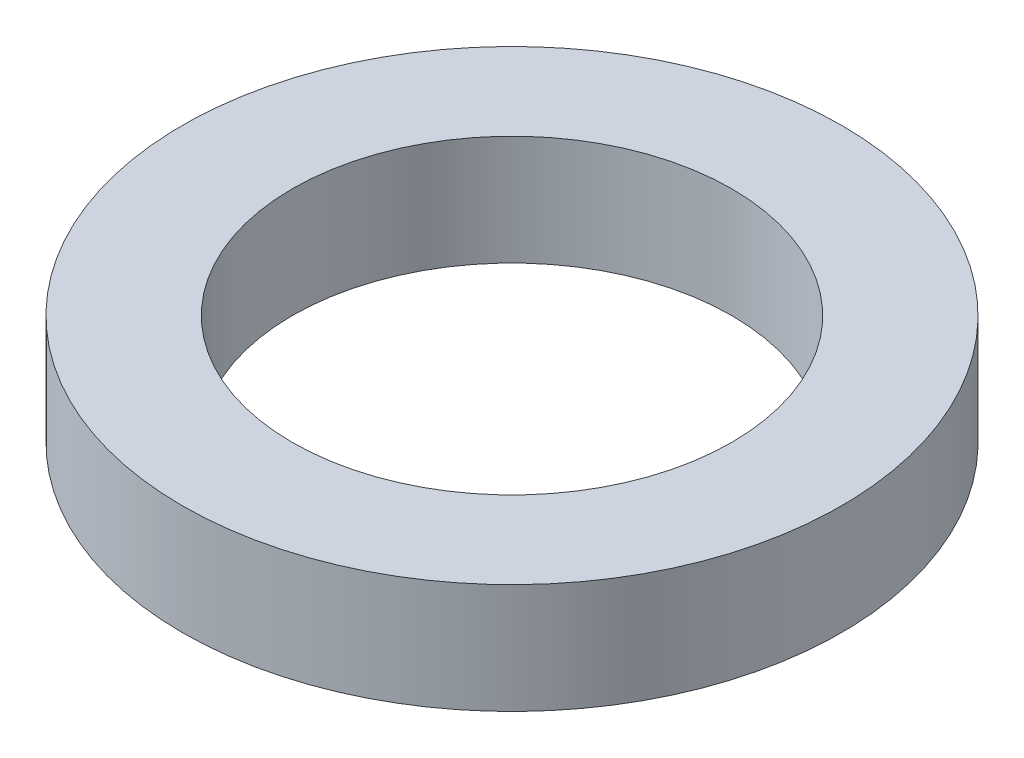
ISO-10303-21;
HEADER;
FILE_DESCRIPTION(('STEP AP214'),'2;1');
FILE_NAME('part.step','',(''),(''),'','','');
FILE_SCHEMA(('AUTOMOTIVE_DESIGN { 1 0 10303 214 1 1 1 1 }'));
ENDSEC;
DATA;
#1=APPLICATION_CONTEXT('core data for automotive mechanical design processes');
#2=APPLICATION_PROTOCOL_DEFINITION('international standard','automotive_design',2000,#1);
#3=PRODUCT_CONTEXT('',#1,'mechanical');
#4=PRODUCT('Part','Part','',(#3));
#5=PRODUCT_RELATED_PRODUCT_CATEGORY('part','',(#4));
#6=PRODUCT_DEFINITION_FORMATION('','',#4);
#7=PRODUCT_DEFINITION_CONTEXT('part definition',#1,'design');
#8=PRODUCT_DEFINITION('design','',#6,#7);
#9=PRODUCT_DEFINITION_SHAPE('','',#8);
#10=(LENGTH_UNIT() NAMED_UNIT(*) SI_UNIT(.MILLI.,.METRE.));
#11=(NAMED_UNIT(*) PLANE_ANGLE_UNIT() SI_UNIT($,.RADIAN.));
#12=(NAMED_UNIT(*) SI_UNIT($,.STERADIAN.) SOLID_ANGLE_UNIT());
#13=UNCERTAINTY_MEASURE_WITH_UNIT(LENGTH_MEASURE(1.E-05),#10,'distance_accuracy_value','');
#14=(GEOMETRIC_REPRESENTATION_CONTEXT(3) GLOBAL_UNCERTAINTY_ASSIGNED_CONTEXT((#13)) GLOBAL_UNIT_ASSIGNED_CONTEXT((#10,
#11,#12)) REPRESENTATION_CONTEXT('',''));
#15=CARTESIAN_POINT('',(0.,0.,0.));
#16=DIRECTION('',(0.,0.,1.));
#17=DIRECTION('',(1.,0.,0.));
#18=AXIS2_PLACEMENT_3D('',#15,#16,#17);
#19=CARTESIAN_POINT('',(0.,3.175,0.));
#20=DIRECTION('',(0.,1.,0.));
#21=DIRECTION('',(0.,0.,1.));
#22=AXIS2_PLACEMENT_3D('',#19,#20,#21);
#23=PLANE('',#22);
#24=CARTESIAN_POINT('',(0.,3.175,0.));
#25=DIRECTION('',(0.,1.,0.));
#26=DIRECTION('',(0.,0.,1.));
#27=AXIS2_PLACEMENT_3D('',#24,#25,#26);
#28=CIRCLE('',#27,9.525);
#29=CARTESIAN_POINT('',(0.,3.175,9.525));
#30=VERTEX_POINT('',#29);
#31=EDGE_CURVE('E10',#30,#30,#28,.T.);
#32=ORIENTED_EDGE('',*,*,#31,.T.);
#33=EDGE_LOOP('',(#32));
#34=FACE_BOUND('',#33,.T.);
#35=CARTESIAN_POINT('',(0.,3.175,0.));
#36=DIRECTION('',(0.,1.,0.));
#37=DIRECTION('',(0.,0.,1.));
#38=AXIS2_PLACEMENT_3D('',#35,#36,#37);
#39=CIRCLE('',#38,6.35);
#40=CARTESIAN_POINT('',(0.,3.175,6.35));
#41=VERTEX_POINT('',#40);
#42=EDGE_CURVE('E43',#41,#41,#39,.T.);
#43=ORIENTED_EDGE('',*,*,#42,.F.);
#44=EDGE_LOOP('',(#43));
#45=FACE_BOUND('',#44,.T.);
#46=ADVANCED_FACE('F32',(#34,#45),#23,.T.);
#47=CARTESIAN_POINT('',(0.,0.,0.));
#48=DIRECTION('',(0.,1.,0.));
#49=DIRECTION('',(0.,0.,1.));
#50=AXIS2_PLACEMENT_3D('',#47,#48,#49);
#51=PLANE('',#50);
#52=CARTESIAN_POINT('',(0.,0.,0.));
#53=DIRECTION('',(0.,1.,0.));
#54=DIRECTION('',(0.,0.,1.));
#55=AXIS2_PLACEMENT_3D('',#52,#53,#54);
#56=CIRCLE('',#55,9.525);
#57=CARTESIAN_POINT('',(0.,0.,9.525));
#58=VERTEX_POINT('',#57);
#59=EDGE_CURVE('E36',#58,#58,#56,.T.);
#60=ORIENTED_EDGE('',*,*,#59,.F.);
#61=EDGE_LOOP('',(#60));
#62=FACE_BOUND('',#61,.T.);
#63=CARTESIAN_POINT('',(0.,0.,0.));
#64=DIRECTION('',(0.,1.,0.));
#65=DIRECTION('',(0.,0.,1.));
#66=AXIS2_PLACEMENT_3D('',#63,#64,#65);
#67=CIRCLE('',#66,6.35);
#68=CARTESIAN_POINT('',(0.,0.,6.35));
#69=VERTEX_POINT('',#68);
#70=EDGE_CURVE('E45',#69,#69,#67,.T.);
#71=ORIENTED_EDGE('',*,*,#70,.T.);
#72=EDGE_LOOP('',(#71));
#73=FACE_BOUND('',#72,.T.);
#74=ADVANCED_FACE('F55',(#62,#73),#51,.F.);
#75=CARTESIAN_POINT('',(0.,3.175,0.));
#76=DIRECTION('',(0.,-1.,0.));
#77=DIRECTION('',(0.,0.,-1.));
#78=AXIS2_PLACEMENT_3D('',#75,#76,#77);
#79=CYLINDRICAL_SURFACE('',#78,9.525);
#80=ORIENTED_EDGE('',*,*,#31,.F.);
#81=EDGE_LOOP('',(#80));
#82=FACE_BOUND('',#81,.T.);
#83=ORIENTED_EDGE('',*,*,#59,.T.);
#84=EDGE_LOOP('',(#83));
#85=FACE_BOUND('',#84,.T.);
#86=ADVANCED_FACE('F34',(#82,#85),#79,.T.);
#87=CARTESIAN_POINT('',(0.,3.175,0.));
#88=DIRECTION('',(0.,-1.,0.));
#89=DIRECTION('',(0.,0.,-1.));
#90=AXIS2_PLACEMENT_3D('',#87,#88,#89);
#91=CYLINDRICAL_SURFACE('',#90,6.35);
#92=ORIENTED_EDGE('',*,*,#42,.T.);
#93=EDGE_LOOP('',(#92));
#94=FACE_BOUND('',#93,.T.);
#95=ORIENTED_EDGE('',*,*,#70,.F.);
#96=EDGE_LOOP('',(#95));
#97=FACE_BOUND('',#96,.T.);
#98=ADVANCED_FACE('F51',(#94,#97),#91,.F.);
#99=CLOSED_SHELL('',(#46,#74,#86,#98));
#100=MANIFOLD_SOLID_BREP('B2',#99);
#101=ADVANCED_BREP_SHAPE_REPRESENTATION('',(#18,#100),#14);
#102=SHAPE_DEFINITION_REPRESENTATION(#9,#101);
ENDSEC;
END-ISO-10303-21;
